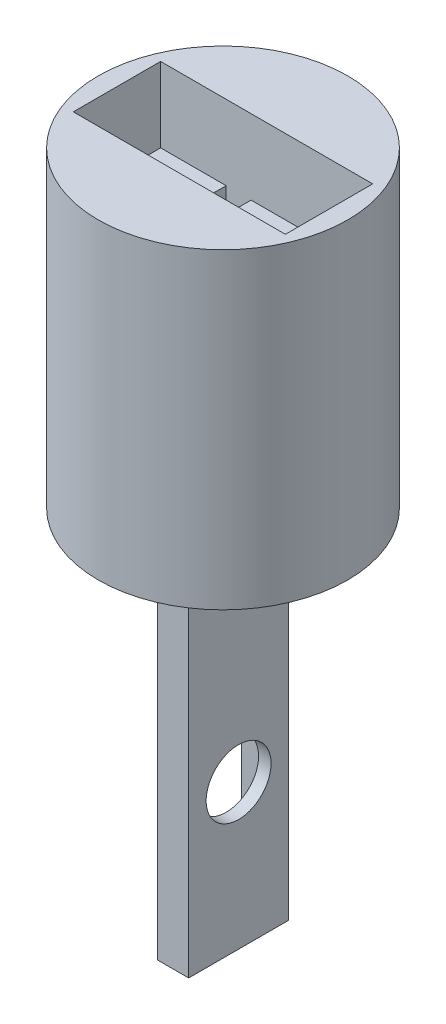
ISO-10303-21;
HEADER;
FILE_DESCRIPTION(('STEP AP214'),'2;1');
FILE_NAME('part.step','',(''),(''),'','','');
FILE_SCHEMA(('AUTOMOTIVE_DESIGN { 1 0 10303 214 1 1 1 1 }'));
ENDSEC;
DATA;
#1=APPLICATION_CONTEXT('core data for automotive mechanical design processes');
#2=APPLICATION_PROTOCOL_DEFINITION('international standard','automotive_design',2000,#1);
#3=PRODUCT_CONTEXT('',#1,'mechanical');
#4=PRODUCT('Part','Part','',(#3));
#5=PRODUCT_RELATED_PRODUCT_CATEGORY('part','',(#4));
#6=PRODUCT_DEFINITION_FORMATION('','',#4);
#7=PRODUCT_DEFINITION_CONTEXT('part definition',#1,'design');
#8=PRODUCT_DEFINITION('design','',#6,#7);
#9=PRODUCT_DEFINITION_SHAPE('','',#8);
#10=(LENGTH_UNIT() NAMED_UNIT(*) SI_UNIT(.MILLI.,.METRE.));
#11=(NAMED_UNIT(*) PLANE_ANGLE_UNIT() SI_UNIT($,.RADIAN.));
#12=(NAMED_UNIT(*) SI_UNIT($,.STERADIAN.) SOLID_ANGLE_UNIT());
#13=UNCERTAINTY_MEASURE_WITH_UNIT(LENGTH_MEASURE(1.E-05),#10,'distance_accuracy_value','');
#14=(GEOMETRIC_REPRESENTATION_CONTEXT(3) GLOBAL_UNCERTAINTY_ASSIGNED_CONTEXT((#13)) GLOBAL_UNIT_ASSIGNED_CONTEXT((#10,
#11,#12)) REPRESENTATION_CONTEXT('',''));
#15=CARTESIAN_POINT('',(0.,0.,0.));
#16=DIRECTION('',(0.,0.,1.));
#17=DIRECTION('',(1.,0.,0.));
#18=AXIS2_PLACEMENT_3D('',#15,#16,#17);
#19=CARTESIAN_POINT('',(0.,19.,0.));
#20=DIRECTION('',(0.,-1.,0.));
#21=DIRECTION('',(0.,0.,-1.));
#22=AXIS2_PLACEMENT_3D('',#19,#20,#21);
#23=PLANE('',#22);
#24=DIRECTION('',(0.,0.,-1.));
#25=VECTOR('',#24,1.);
#26=CARTESIAN_POINT('',(-1.25,19.,-3.5));
#27=LINE('',#26,#25);
#28=CARTESIAN_POINT('',(-1.25,19.,3.5));
#29=VERTEX_POINT('',#28);
#30=CARTESIAN_POINT('',(-1.25,19.,-3.5));
#31=VERTEX_POINT('',#30);
#32=EDGE_CURVE('E160',#29,#31,#27,.T.);
#33=ORIENTED_EDGE('',*,*,#32,.F.);
#34=DIRECTION('',(1.,0.,0.));
#35=VECTOR('',#34,1.);
#36=CARTESIAN_POINT('',(-8.5,19.,3.5));
#37=LINE('',#36,#35);
#38=CARTESIAN_POINT('',(8.5,19.,3.5));
#39=VERTEX_POINT('',#38);
#40=EDGE_CURVE('E192',#29,#39,#37,.T.);
#41=ORIENTED_EDGE('',*,*,#40,.T.);
#42=DIRECTION('',(0.,0.,-1.));
#43=VECTOR('',#42,1.);
#44=CARTESIAN_POINT('',(8.5,19.,3.5));
#45=LINE('',#44,#43);
#46=CARTESIAN_POINT('',(8.5,19.,-3.5));
#47=VERTEX_POINT('',#46);
#48=EDGE_CURVE('E197',#39,#47,#45,.T.);
#49=ORIENTED_EDGE('',*,*,#48,.T.);
#50=DIRECTION('',(-1.,0.,0.));
#51=VECTOR('',#50,1.);
#52=CARTESIAN_POINT('',(-8.5,19.,-3.5));
#53=LINE('',#52,#51);
#54=EDGE_CURVE('E201',#47,#31,#53,.T.);
#55=ORIENTED_EDGE('',*,*,#54,.T.);
#56=EDGE_LOOP('',(#33,#41,#49,#55));
#57=FACE_BOUND('',#56,.T.);
#58=ADVANCED_FACE('F37',(#57),#23,.F.);
#59=DIRECTION('',(0.,0.,1.));
#60=VECTOR('',#59,1.);
#61=CARTESIAN_POINT('',(-3.25,19.,-3.5));
#62=LINE('',#61,#60);
#63=CARTESIAN_POINT('',(-3.25,19.,-3.5));
#64=VERTEX_POINT('',#63);
#65=CARTESIAN_POINT('',(-3.25,19.,3.5));
#66=VERTEX_POINT('',#65);
#67=EDGE_CURVE('E177',#64,#66,#62,.T.);
#68=ORIENTED_EDGE('',*,*,#67,.F.);
#69=CARTESIAN_POINT('',(-8.5,19.,-3.5));
#70=VERTEX_POINT('',#69);
#71=EDGE_CURVE('E200',#64,#70,#53,.T.);
#72=ORIENTED_EDGE('',*,*,#71,.T.);
#73=DIRECTION('',(0.,0.,1.));
#74=VECTOR('',#73,1.);
#75=CARTESIAN_POINT('',(-8.5,19.,3.5));
#76=LINE('',#75,#74);
#77=CARTESIAN_POINT('',(-8.5,19.,3.5));
#78=VERTEX_POINT('',#77);
#79=EDGE_CURVE('E189',#70,#78,#76,.T.);
#80=ORIENTED_EDGE('',*,*,#79,.T.);
#81=EDGE_CURVE('E194',#78,#66,#37,.T.);
#82=ORIENTED_EDGE('',*,*,#81,.T.);
#83=EDGE_LOOP('',(#68,#72,#80,#82));
#84=FACE_BOUND('',#83,.T.);
#85=ADVANCED_FACE('F293',(#84),#23,.F.);
#86=CARTESIAN_POINT('',(0.,0.,0.));
#87=DIRECTION('',(0.,1.,0.));
#88=DIRECTION('',(0.,0.,1.));
#89=AXIS2_PLACEMENT_3D('',#86,#87,#88);
#90=PLANE('',#89);
#91=CARTESIAN_POINT('',(0.,0.,0.));
#92=DIRECTION('',(0.,1.,0.));
#93=DIRECTION('',(0.,0.,1.));
#94=AXIS2_PLACEMENT_3D('',#91,#92,#93);
#95=CIRCLE('',#94,10.);
#96=CARTESIAN_POINT('',(0.,0.,10.));
#97=VERTEX_POINT('',#96);
#98=EDGE_CURVE('E46',#97,#97,#95,.T.);
#99=ORIENTED_EDGE('',*,*,#98,.F.);
#100=EDGE_LOOP('',(#99));
#101=FACE_BOUND('',#100,.T.);
#102=DIRECTION('',(0.,0.,1.));
#103=VECTOR('',#102,1.);
#104=CARTESIAN_POINT('',(1.25,0.,-4.));
#105=LINE('',#104,#103);
#106=CARTESIAN_POINT('',(1.25,0.,-4.));
#107=VERTEX_POINT('',#106);
#108=CARTESIAN_POINT('',(1.25,0.,4.));
#109=VERTEX_POINT('',#108);
#110=EDGE_CURVE('E254',#107,#109,#105,.T.);
#111=ORIENTED_EDGE('',*,*,#110,.F.);
#112=DIRECTION('',(1.,0.,0.));
#113=VECTOR('',#112,1.);
#114=CARTESIAN_POINT('',(-1.25,0.,-4.));
#115=LINE('',#114,#113);
#116=CARTESIAN_POINT('',(-1.25,0.,-4.));
#117=VERTEX_POINT('',#116);
#118=EDGE_CURVE('E259',#117,#107,#115,.T.);
#119=ORIENTED_EDGE('',*,*,#118,.F.);
#120=DIRECTION('',(0.,0.,-1.));
#121=VECTOR('',#120,1.);
#122=CARTESIAN_POINT('',(-1.25,0.,-4.));
#123=LINE('',#122,#121);
#124=CARTESIAN_POINT('',(-1.25,0.,4.));
#125=VERTEX_POINT('',#124);
#126=EDGE_CURVE('E271',#125,#117,#123,.T.);
#127=ORIENTED_EDGE('',*,*,#126,.F.);
#128=DIRECTION('',(-1.,0.,0.));
#129=VECTOR('',#128,1.);
#130=CARTESIAN_POINT('',(-1.25,0.,4.));
#131=LINE('',#130,#129);
#132=EDGE_CURVE('E268',#109,#125,#131,.T.);
#133=ORIENTED_EDGE('',*,*,#132,.F.);
#134=EDGE_LOOP('',(#111,#119,#127,#133));
#135=FACE_BOUND('',#134,.T.);
#136=ADVANCED_FACE('F290',(#101,#135),#90,.F.);
#137=CARTESIAN_POINT('',(0.,25.,0.));
#138=DIRECTION('',(0.,-1.,0.));
#139=DIRECTION('',(0.,0.,-1.));
#140=AXIS2_PLACEMENT_3D('',#137,#138,#139);
#141=CYLINDRICAL_SURFACE('',#140,10.);
#142=CARTESIAN_POINT('',(0.,25.,0.));
#143=DIRECTION('',(0.,1.,0.));
#144=DIRECTION('',(0.,0.,1.));
#145=AXIS2_PLACEMENT_3D('',#142,#143,#144);
#146=CIRCLE('',#145,10.);
#147=CARTESIAN_POINT('',(0.,25.,10.));
#148=VERTEX_POINT('',#147);
#149=EDGE_CURVE('E11',#148,#148,#146,.T.);
#150=ORIENTED_EDGE('',*,*,#149,.F.);
#151=EDGE_LOOP('',(#150));
#152=FACE_BOUND('',#151,.T.);
#153=ORIENTED_EDGE('',*,*,#98,.T.);
#154=EDGE_LOOP('',(#153));
#155=FACE_BOUND('',#154,.T.);
#156=ADVANCED_FACE('F39',(#152,#155),#141,.T.);
#157=CARTESIAN_POINT('',(0.,25.,0.));
#158=DIRECTION('',(0.,1.,0.));
#159=DIRECTION('',(0.,0.,1.));
#160=AXIS2_PLACEMENT_3D('',#157,#158,#159);
#161=PLANE('',#160);
#162=DIRECTION('',(0.,0.,1.));
#163=VECTOR('',#162,1.);
#164=CARTESIAN_POINT('',(-8.5,25.,3.5));
#165=LINE('',#164,#163);
#166=CARTESIAN_POINT('',(-8.5,25.,-3.5));
#167=VERTEX_POINT('',#166);
#168=CARTESIAN_POINT('',(-8.5,25.,3.5));
#169=VERTEX_POINT('',#168);
#170=EDGE_CURVE('E62',#167,#169,#165,.T.);
#171=ORIENTED_EDGE('',*,*,#170,.F.);
#172=DIRECTION('',(-1.,0.,0.));
#173=VECTOR('',#172,1.);
#174=CARTESIAN_POINT('',(-8.5,25.,-3.5));
#175=LINE('',#174,#173);
#176=CARTESIAN_POINT('',(8.5,25.,-3.5));
#177=VERTEX_POINT('',#176);
#178=EDGE_CURVE('E193',#177,#167,#175,.T.);
#179=ORIENTED_EDGE('',*,*,#178,.F.);
#180=DIRECTION('',(0.,0.,-1.));
#181=VECTOR('',#180,1.);
#182=CARTESIAN_POINT('',(8.5,25.,3.5));
#183=LINE('',#182,#181);
#184=CARTESIAN_POINT('',(8.5,25.,3.5));
#185=VERTEX_POINT('',#184);
#186=EDGE_CURVE('E208',#185,#177,#183,.T.);
#187=ORIENTED_EDGE('',*,*,#186,.F.);
#188=DIRECTION('',(1.,0.,0.));
#189=VECTOR('',#188,1.);
#190=CARTESIAN_POINT('',(-8.5,25.,3.5));
#191=LINE('',#190,#189);
#192=EDGE_CURVE('E205',#169,#185,#191,.T.);
#193=ORIENTED_EDGE('',*,*,#192,.F.);
#194=EDGE_LOOP('',(#171,#179,#187,#193));
#195=FACE_BOUND('',#194,.T.);
#196=ORIENTED_EDGE('',*,*,#149,.T.);
#197=EDGE_LOOP('',(#196));
#198=FACE_BOUND('',#197,.T.);
#199=ADVANCED_FACE('F319',(#195,#198),#161,.T.);
#200=CARTESIAN_POINT('',(1.25,-30.,-4.));
#201=DIRECTION('',(-1.,0.,0.));
#202=DIRECTION('',(0.,0.,1.));
#203=AXIS2_PLACEMENT_3D('',#200,#201,#202);
#204=PLANE('',#203);
#205=CARTESIAN_POINT('',(1.25,-18.4,0.));
#206=DIRECTION('',(1.,0.,0.));
#207=DIRECTION('',(0.,0.,-1.));
#208=AXIS2_PLACEMENT_3D('',#205,#206,#207);
#209=CIRCLE('',#208,2.6);
#210=CARTESIAN_POINT('',(1.25,-18.4,-2.6));
#211=VERTEX_POINT('',#210);
#212=EDGE_CURVE('E251',#211,#211,#209,.T.);
#213=ORIENTED_EDGE('',*,*,#212,.F.);
#214=EDGE_LOOP('',(#213));
#215=FACE_BOUND('',#214,.T.);
#216=ORIENTED_EDGE('',*,*,#110,.T.);
#217=DIRECTION('',(0.,1.,0.));
#218=VECTOR('',#217,1.);
#219=CARTESIAN_POINT('',(1.25,-30.,4.));
#220=LINE('',#219,#218);
#221=CARTESIAN_POINT('',(1.25,-30.,4.));
#222=VERTEX_POINT('',#221);
#223=EDGE_CURVE('E284',#222,#109,#220,.T.);
#224=ORIENTED_EDGE('',*,*,#223,.F.);
#225=DIRECTION('',(0.,0.,1.));
#226=VECTOR('',#225,1.);
#227=CARTESIAN_POINT('',(1.25,-30.,-4.));
#228=LINE('',#227,#226);
#229=CARTESIAN_POINT('',(1.25,-30.,-4.));
#230=VERTEX_POINT('',#229);
#231=EDGE_CURVE('E255',#230,#222,#228,.T.);
#232=ORIENTED_EDGE('',*,*,#231,.F.);
#233=DIRECTION('',(0.,1.,0.));
#234=VECTOR('',#233,1.);
#235=CARTESIAN_POINT('',(1.25,-30.,-4.));
#236=LINE('',#235,#234);
#237=EDGE_CURVE('E265',#230,#107,#236,.T.);
#238=ORIENTED_EDGE('',*,*,#237,.T.);
#239=EDGE_LOOP('',(#216,#224,#232,#238));
#240=FACE_BOUND('',#239,.T.);
#241=ADVANCED_FACE('F302',(#215,#240),#204,.F.);
#242=CARTESIAN_POINT('',(-1.25,-30.,4.));
#243=DIRECTION('',(0.,0.,-1.));
#244=DIRECTION('',(-1.,0.,0.));
#245=AXIS2_PLACEMENT_3D('',#242,#243,#244);
#246=PLANE('',#245);
#247=ORIENTED_EDGE('',*,*,#132,.T.);
#248=DIRECTION('',(0.,1.,0.));
#249=VECTOR('',#248,1.);
#250=CARTESIAN_POINT('',(-1.25,-30.,4.));
#251=LINE('',#250,#249);
#252=CARTESIAN_POINT('',(-1.25,-30.,4.));
#253=VERTEX_POINT('',#252);
#254=EDGE_CURVE('E281',#253,#125,#251,.T.);
#255=ORIENTED_EDGE('',*,*,#254,.F.);
#256=DIRECTION('',(-1.,0.,0.));
#257=VECTOR('',#256,1.);
#258=CARTESIAN_POINT('',(-1.25,-30.,4.));
#259=LINE('',#258,#257);
#260=EDGE_CURVE('E258',#222,#253,#259,.T.);
#261=ORIENTED_EDGE('',*,*,#260,.F.);
#262=ORIENTED_EDGE('',*,*,#223,.T.);
#263=EDGE_LOOP('',(#247,#255,#261,#262));
#264=FACE_BOUND('',#263,.T.);
#265=ADVANCED_FACE('F310',(#264),#246,.F.);
#266=CARTESIAN_POINT('',(-1.25,-30.,-4.));
#267=DIRECTION('',(1.,0.,0.));
#268=DIRECTION('',(0.,0.,-1.));
#269=AXIS2_PLACEMENT_3D('',#266,#267,#268);
#270=PLANE('',#269);
#271=DIRECTION('',(0.,0.,-1.));
#272=VECTOR('',#271,1.);
#273=CARTESIAN_POINT('',(-1.25,-7.8,-2.75));
#274=LINE('',#273,#272);
#275=CARTESIAN_POINT('',(-1.25,-7.8,2.75));
#276=VERTEX_POINT('',#275);
#277=CARTESIAN_POINT('',(-1.25,-7.8,-2.75));
#278=VERTEX_POINT('',#277);
#279=EDGE_CURVE('E235',#276,#278,#274,.T.);
#280=ORIENTED_EDGE('',*,*,#279,.F.);
#281=DIRECTION('',(0.,1.,0.));
#282=VECTOR('',#281,1.);
#283=CARTESIAN_POINT('',(-1.25,-29.,2.75));
#284=LINE('',#283,#282);
#285=CARTESIAN_POINT('',(-1.25,-29.,2.75));
#286=VERTEX_POINT('',#285);
#287=EDGE_CURVE('E214',#286,#276,#284,.T.);
#288=ORIENTED_EDGE('',*,*,#287,.F.);
#289=DIRECTION('',(0.,0.,1.));
#290=VECTOR('',#289,1.);
#291=CARTESIAN_POINT('',(-1.25,-29.,-2.75));
#292=LINE('',#291,#290);
#293=CARTESIAN_POINT('',(-1.25,-29.,-2.75));
#294=VERTEX_POINT('',#293);
#295=EDGE_CURVE('E224',#294,#286,#292,.T.);
#296=ORIENTED_EDGE('',*,*,#295,.F.);
#297=DIRECTION('',(0.,-1.,0.));
#298=VECTOR('',#297,1.);
#299=CARTESIAN_POINT('',(-1.25,-29.,-2.75));
#300=LINE('',#299,#298);
#301=EDGE_CURVE('E238',#278,#294,#300,.T.);
#302=ORIENTED_EDGE('',*,*,#301,.F.);
#303=EDGE_LOOP('',(#280,#288,#296,#302));
#304=FACE_BOUND('',#303,.T.);
#305=ORIENTED_EDGE('',*,*,#126,.T.);
#306=DIRECTION('',(0.,1.,0.));
#307=VECTOR('',#306,1.);
#308=CARTESIAN_POINT('',(-1.25,-30.,-4.));
#309=LINE('',#308,#307);
#310=CARTESIAN_POINT('',(-1.25,-30.,-4.));
#311=VERTEX_POINT('',#310);
#312=EDGE_CURVE('E278',#311,#117,#309,.T.);
#313=ORIENTED_EDGE('',*,*,#312,.F.);
#314=DIRECTION('',(0.,0.,-1.));
#315=VECTOR('',#314,1.);
#316=CARTESIAN_POINT('',(-1.25,-30.,-4.));
#317=LINE('',#316,#315);
#318=EDGE_CURVE('E261',#253,#311,#317,.T.);
#319=ORIENTED_EDGE('',*,*,#318,.F.);
#320=ORIENTED_EDGE('',*,*,#254,.T.);
#321=EDGE_LOOP('',(#305,#313,#319,#320));
#322=FACE_BOUND('',#321,.T.);
#323=ADVANCED_FACE('F308',(#304,#322),#270,.F.);
#324=CARTESIAN_POINT('',(-1.25,-30.,-4.));
#325=DIRECTION('',(0.,0.,1.));
#326=DIRECTION('',(1.,0.,0.));
#327=AXIS2_PLACEMENT_3D('',#324,#325,#326);
#328=PLANE('',#327);
#329=ORIENTED_EDGE('',*,*,#118,.T.);
#330=ORIENTED_EDGE('',*,*,#237,.F.);
#331=DIRECTION('',(1.,0.,0.));
#332=VECTOR('',#331,1.);
#333=CARTESIAN_POINT('',(-1.25,-30.,-4.));
#334=LINE('',#333,#332);
#335=EDGE_CURVE('E263',#311,#230,#334,.T.);
#336=ORIENTED_EDGE('',*,*,#335,.F.);
#337=ORIENTED_EDGE('',*,*,#312,.T.);
#338=EDGE_LOOP('',(#329,#330,#336,#337));
#339=FACE_BOUND('',#338,.T.);
#340=ADVANCED_FACE('F298',(#339),#328,.F.);
#341=CARTESIAN_POINT('',(0.,-30.,0.));
#342=DIRECTION('',(0.,1.,0.));
#343=DIRECTION('',(0.,0.,1.));
#344=AXIS2_PLACEMENT_3D('',#341,#342,#343);
#345=PLANE('',#344);
#346=ORIENTED_EDGE('',*,*,#231,.T.);
#347=ORIENTED_EDGE('',*,*,#260,.T.);
#348=ORIENTED_EDGE('',*,*,#318,.T.);
#349=ORIENTED_EDGE('',*,*,#335,.T.);
#350=EDGE_LOOP('',(#346,#347,#348,#349));
#351=FACE_BOUND('',#350,.T.);
#352=ADVANCED_FACE('F304',(#351),#345,.F.);
#353=CARTESIAN_POINT('',(-10.001,-18.4,0.));
#354=DIRECTION('',(1.,0.,0.));
#355=DIRECTION('',(0.,0.,-1.));
#356=AXIS2_PLACEMENT_3D('',#353,#354,#355);
#357=CYLINDRICAL_SURFACE('',#356,2.6);
#358=CARTESIAN_POINT('',(0.249999999999999,-18.4,0.));
#359=DIRECTION('',(1.,0.,0.));
#360=DIRECTION('',(0.,0.,-1.));
#361=AXIS2_PLACEMENT_3D('',#358,#359,#360);
#362=CIRCLE('',#361,2.6);
#363=CARTESIAN_POINT('',(0.249999999999999,-18.4,-2.6));
#364=VERTEX_POINT('',#363);
#365=EDGE_CURVE('E41',#364,#364,#362,.F.);
#366=ORIENTED_EDGE('',*,*,#365,.T.);
#367=EDGE_LOOP('',(#366));
#368=FACE_BOUND('',#367,.T.);
#369=ORIENTED_EDGE('',*,*,#212,.T.);
#370=EDGE_LOOP('',(#369));
#371=FACE_BOUND('',#370,.T.);
#372=ADVANCED_FACE('F350',(#368,#371),#357,.F.);
#373=CARTESIAN_POINT('',(0.249999999999999,0.,0.));
#374=DIRECTION('',(1.,0.,0.));
#375=DIRECTION('',(0.,0.,-1.));
#376=AXIS2_PLACEMENT_3D('',#373,#374,#375);
#377=PLANE('',#376);
#378=DIRECTION('',(0.,1.,0.));
#379=VECTOR('',#378,1.);
#380=CARTESIAN_POINT('',(0.249999999999999,-29.,2.75));
#381=LINE('',#380,#379);
#382=CARTESIAN_POINT('',(0.249999999999999,-29.,2.75));
#383=VERTEX_POINT('',#382);
#384=CARTESIAN_POINT('',(0.249999999999999,-7.8,2.75));
#385=VERTEX_POINT('',#384);
#386=EDGE_CURVE('E220',#383,#385,#381,.T.);
#387=ORIENTED_EDGE('',*,*,#386,.T.);
#388=DIRECTION('',(0.,0.,-1.));
#389=VECTOR('',#388,1.);
#390=CARTESIAN_POINT('',(0.25,-7.8,-2.75));
#391=LINE('',#390,#389);
#392=CARTESIAN_POINT('',(0.25,-7.8,-2.75));
#393=VERTEX_POINT('',#392);
#394=EDGE_CURVE('E223',#385,#393,#391,.T.);
#395=ORIENTED_EDGE('',*,*,#394,.T.);
#396=DIRECTION('',(0.,-1.,0.));
#397=VECTOR('',#396,1.);
#398=CARTESIAN_POINT('',(0.25,-29.,-2.75));
#399=LINE('',#398,#397);
#400=CARTESIAN_POINT('',(0.25,-29.,-2.75));
#401=VERTEX_POINT('',#400);
#402=EDGE_CURVE('E227',#393,#401,#399,.T.);
#403=ORIENTED_EDGE('',*,*,#402,.T.);
#404=DIRECTION('',(0.,0.,1.));
#405=VECTOR('',#404,1.);
#406=CARTESIAN_POINT('',(0.25,-29.,-2.75));
#407=LINE('',#406,#405);
#408=EDGE_CURVE('E230',#401,#383,#407,.T.);
#409=ORIENTED_EDGE('',*,*,#408,.T.);
#410=EDGE_LOOP('',(#387,#395,#403,#409));
#411=FACE_BOUND('',#410,.T.);
#412=ORIENTED_EDGE('',*,*,#365,.F.);
#413=EDGE_LOOP('',(#412));
#414=FACE_BOUND('',#413,.T.);
#415=ADVANCED_FACE('F346',(#411,#414),#377,.F.);
#416=CARTESIAN_POINT('',(0.249999999999999,-29.,2.75));
#417=DIRECTION('',(0.,0.,1.));
#418=DIRECTION('',(1.,0.,0.));
#419=AXIS2_PLACEMENT_3D('',#416,#417,#418);
#420=PLANE('',#419);
#421=ORIENTED_EDGE('',*,*,#287,.T.);
#422=DIRECTION('',(-1.,0.,0.));
#423=VECTOR('',#422,1.);
#424=CARTESIAN_POINT('',(0.249999999999999,-7.8,2.75));
#425=LINE('',#424,#423);
#426=EDGE_CURVE('E233',#385,#276,#425,.T.);
#427=ORIENTED_EDGE('',*,*,#426,.F.);
#428=ORIENTED_EDGE('',*,*,#386,.F.);
#429=DIRECTION('',(-1.,0.,0.));
#430=VECTOR('',#429,1.);
#431=CARTESIAN_POINT('',(0.249999999999999,-29.,2.75));
#432=LINE('',#431,#430);
#433=EDGE_CURVE('E243',#383,#286,#432,.T.);
#434=ORIENTED_EDGE('',*,*,#433,.T.);
#435=EDGE_LOOP('',(#421,#427,#428,#434));
#436=FACE_BOUND('',#435,.T.);
#437=ADVANCED_FACE('F349',(#436),#420,.F.);
#438=CARTESIAN_POINT('',(0.25,-29.,-2.75));
#439=DIRECTION('',(0.,-1.,0.));
#440=DIRECTION('',(0.,0.,-1.));
#441=AXIS2_PLACEMENT_3D('',#438,#439,#440);
#442=PLANE('',#441);
#443=ORIENTED_EDGE('',*,*,#295,.T.);
#444=ORIENTED_EDGE('',*,*,#433,.F.);
#445=ORIENTED_EDGE('',*,*,#408,.F.);
#446=DIRECTION('',(-1.,0.,0.));
#447=VECTOR('',#446,1.);
#448=CARTESIAN_POINT('',(0.25,-29.,-2.75));
#449=LINE('',#448,#447);
#450=EDGE_CURVE('E245',#401,#294,#449,.T.);
#451=ORIENTED_EDGE('',*,*,#450,.T.);
#452=EDGE_LOOP('',(#443,#444,#445,#451));
#453=FACE_BOUND('',#452,.T.);
#454=ADVANCED_FACE('F352',(#453),#442,.F.);
#455=CARTESIAN_POINT('',(0.25,-29.,-2.75));
#456=DIRECTION('',(0.,0.,-1.));
#457=DIRECTION('',(-1.,0.,0.));
#458=AXIS2_PLACEMENT_3D('',#455,#456,#457);
#459=PLANE('',#458);
#460=ORIENTED_EDGE('',*,*,#301,.T.);
#461=ORIENTED_EDGE('',*,*,#450,.F.);
#462=ORIENTED_EDGE('',*,*,#402,.F.);
#463=DIRECTION('',(-1.,0.,0.));
#464=VECTOR('',#463,1.);
#465=CARTESIAN_POINT('',(0.25,-7.8,-2.75));
#466=LINE('',#465,#464);
#467=EDGE_CURVE('E247',#393,#278,#466,.T.);
#468=ORIENTED_EDGE('',*,*,#467,.T.);
#469=EDGE_LOOP('',(#460,#461,#462,#468));
#470=FACE_BOUND('',#469,.T.);
#471=ADVANCED_FACE('F355',(#470),#459,.F.);
#472=CARTESIAN_POINT('',(0.25,-7.8,-2.75));
#473=DIRECTION('',(0.,1.,0.));
#474=DIRECTION('',(0.,0.,1.));
#475=AXIS2_PLACEMENT_3D('',#472,#473,#474);
#476=PLANE('',#475);
#477=ORIENTED_EDGE('',*,*,#279,.T.);
#478=ORIENTED_EDGE('',*,*,#467,.F.);
#479=ORIENTED_EDGE('',*,*,#394,.F.);
#480=ORIENTED_EDGE('',*,*,#426,.T.);
#481=EDGE_LOOP('',(#477,#478,#479,#480));
#482=FACE_BOUND('',#481,.T.);
#483=ADVANCED_FACE('F345',(#482),#476,.F.);
#484=CARTESIAN_POINT('',(-8.5,19.,3.5));
#485=DIRECTION('',(-1.,0.,0.));
#486=DIRECTION('',(0.,0.,1.));
#487=AXIS2_PLACEMENT_3D('',#484,#485,#486);
#488=PLANE('',#487);
#489=ORIENTED_EDGE('',*,*,#170,.T.);
#490=DIRECTION('',(0.,1.,0.));
#491=VECTOR('',#490,1.);
#492=CARTESIAN_POINT('',(-8.5,19.,3.5));
#493=LINE('',#492,#491);
#494=EDGE_CURVE('E203',#78,#169,#493,.T.);
#495=ORIENTED_EDGE('',*,*,#494,.F.);
#496=ORIENTED_EDGE('',*,*,#79,.F.);
#497=DIRECTION('',(0.,1.,0.));
#498=VECTOR('',#497,1.);
#499=CARTESIAN_POINT('',(-8.5,19.,-3.5));
#500=LINE('',#499,#498);
#501=EDGE_CURVE('E212',#70,#167,#500,.T.);
#502=ORIENTED_EDGE('',*,*,#501,.T.);
#503=EDGE_LOOP('',(#489,#495,#496,#502));
#504=FACE_BOUND('',#503,.T.);
#505=ADVANCED_FACE('F335',(#504),#488,.F.);
#506=CARTESIAN_POINT('',(-8.5,19.,-3.5));
#507=DIRECTION('',(0.,0.,-1.));
#508=DIRECTION('',(-1.,0.,0.));
#509=AXIS2_PLACEMENT_3D('',#506,#507,#508);
#510=PLANE('',#509);
#511=ORIENTED_EDGE('',*,*,#178,.T.);
#512=ORIENTED_EDGE('',*,*,#501,.F.);
#513=ORIENTED_EDGE('',*,*,#71,.F.);
#514=DIRECTION('',(0.,1.,0.));
#515=VECTOR('',#514,1.);
#516=CARTESIAN_POINT('',(-3.25,15.,-3.5));
#517=LINE('',#516,#515);
#518=CARTESIAN_POINT('',(-3.25,15.,-3.5));
#519=VERTEX_POINT('',#518);
#520=EDGE_CURVE('E54',#519,#64,#517,.T.);
#521=ORIENTED_EDGE('',*,*,#520,.F.);
#522=DIRECTION('',(-1.,0.,0.));
#523=VECTOR('',#522,1.);
#524=CARTESIAN_POINT('',(-1.25,15.,-3.5));
#525=LINE('',#524,#523);
#526=CARTESIAN_POINT('',(-1.25,15.,-3.5));
#527=VERTEX_POINT('',#526);
#528=EDGE_CURVE('E167',#527,#519,#525,.T.);
#529=ORIENTED_EDGE('',*,*,#528,.F.);
#530=DIRECTION('',(0.,1.,0.));
#531=VECTOR('',#530,1.);
#532=CARTESIAN_POINT('',(-1.25,15.,-3.5));
#533=LINE('',#532,#531);
#534=EDGE_CURVE('E153',#527,#31,#533,.T.);
#535=ORIENTED_EDGE('',*,*,#534,.T.);
#536=ORIENTED_EDGE('',*,*,#54,.F.);
#537=DIRECTION('',(0.,1.,0.));
#538=VECTOR('',#537,1.);
#539=CARTESIAN_POINT('',(8.5,19.,-3.5));
#540=LINE('',#539,#538);
#541=EDGE_CURVE('E215',#47,#177,#540,.T.);
#542=ORIENTED_EDGE('',*,*,#541,.T.);
#543=EDGE_LOOP('',(#511,#512,#513,#521,#529,#535,#536,#542));
#544=FACE_BOUND('',#543,.T.);
#545=ADVANCED_FACE('F169',(#544),#510,.F.);
#546=CARTESIAN_POINT('',(8.5,19.,3.5));
#547=DIRECTION('',(1.,0.,0.));
#548=DIRECTION('',(0.,0.,-1.));
#549=AXIS2_PLACEMENT_3D('',#546,#547,#548);
#550=PLANE('',#549);
#551=ORIENTED_EDGE('',*,*,#186,.T.);
#552=ORIENTED_EDGE('',*,*,#541,.F.);
#553=ORIENTED_EDGE('',*,*,#48,.F.);
#554=DIRECTION('',(0.,1.,0.));
#555=VECTOR('',#554,1.);
#556=CARTESIAN_POINT('',(8.5,19.,3.5));
#557=LINE('',#556,#555);
#558=EDGE_CURVE('E217',#39,#185,#557,.T.);
#559=ORIENTED_EDGE('',*,*,#558,.T.);
#560=EDGE_LOOP('',(#551,#552,#553,#559));
#561=FACE_BOUND('',#560,.T.);
#562=ADVANCED_FACE('F334',(#561),#550,.F.);
#563=CARTESIAN_POINT('',(-8.5,19.,3.5));
#564=DIRECTION('',(0.,0.,1.));
#565=DIRECTION('',(1.,0.,0.));
#566=AXIS2_PLACEMENT_3D('',#563,#564,#565);
#567=PLANE('',#566);
#568=ORIENTED_EDGE('',*,*,#192,.T.);
#569=ORIENTED_EDGE('',*,*,#558,.F.);
#570=ORIENTED_EDGE('',*,*,#40,.F.);
#571=DIRECTION('',(0.,1.,0.));
#572=VECTOR('',#571,1.);
#573=CARTESIAN_POINT('',(-1.25,15.,3.5));
#574=LINE('',#573,#572);
#575=CARTESIAN_POINT('',(-1.25,15.,3.5));
#576=VERTEX_POINT('',#575);
#577=EDGE_CURVE('E184',#576,#29,#574,.T.);
#578=ORIENTED_EDGE('',*,*,#577,.F.);
#579=DIRECTION('',(1.,0.,0.));
#580=VECTOR('',#579,1.);
#581=CARTESIAN_POINT('',(-1.25,15.,3.5));
#582=LINE('',#581,#580);
#583=CARTESIAN_POINT('',(-3.25,15.,3.5));
#584=VERTEX_POINT('',#583);
#585=EDGE_CURVE('E164',#584,#576,#582,.T.);
#586=ORIENTED_EDGE('',*,*,#585,.F.);
#587=DIRECTION('',(0.,1.,0.));
#588=VECTOR('',#587,1.);
#589=CARTESIAN_POINT('',(-3.25,15.,3.5));
#590=LINE('',#589,#588);
#591=EDGE_CURVE('E186',#584,#66,#590,.T.);
#592=ORIENTED_EDGE('',*,*,#591,.T.);
#593=ORIENTED_EDGE('',*,*,#81,.F.);
#594=ORIENTED_EDGE('',*,*,#494,.T.);
#595=EDGE_LOOP('',(#568,#569,#570,#578,#586,#592,#593,#594));
#596=FACE_BOUND('',#595,.T.);
#597=ADVANCED_FACE('F338',(#596),#567,.F.);
#598=CARTESIAN_POINT('',(-1.25,15.,-3.5));
#599=DIRECTION('',(1.,0.,0.));
#600=DIRECTION('',(0.,0.,-1.));
#601=AXIS2_PLACEMENT_3D('',#598,#599,#600);
#602=PLANE('',#601);
#603=ORIENTED_EDGE('',*,*,#32,.T.);
#604=ORIENTED_EDGE('',*,*,#534,.F.);
#605=DIRECTION('',(0.,0.,-1.));
#606=VECTOR('',#605,1.);
#607=CARTESIAN_POINT('',(-1.25,15.,-3.5));
#608=LINE('',#607,#606);
#609=EDGE_CURVE('E157',#576,#527,#608,.T.);
#610=ORIENTED_EDGE('',*,*,#609,.F.);
#611=ORIENTED_EDGE('',*,*,#577,.T.);
#612=EDGE_LOOP('',(#603,#604,#610,#611));
#613=FACE_BOUND('',#612,.T.);
#614=ADVANCED_FACE('F155',(#613),#602,.F.);
#615=CARTESIAN_POINT('',(-3.25,15.,-3.5));
#616=DIRECTION('',(-1.,0.,0.));
#617=DIRECTION('',(0.,0.,1.));
#618=AXIS2_PLACEMENT_3D('',#615,#616,#617);
#619=PLANE('',#618);
#620=ORIENTED_EDGE('',*,*,#67,.T.);
#621=ORIENTED_EDGE('',*,*,#591,.F.);
#622=DIRECTION('',(0.,0.,1.));
#623=VECTOR('',#622,1.);
#624=CARTESIAN_POINT('',(-3.25,15.,-3.5));
#625=LINE('',#624,#623);
#626=EDGE_CURVE('E173',#519,#584,#625,.T.);
#627=ORIENTED_EDGE('',*,*,#626,.F.);
#628=ORIENTED_EDGE('',*,*,#520,.T.);
#629=EDGE_LOOP('',(#620,#621,#627,#628));
#630=FACE_BOUND('',#629,.T.);
#631=ADVANCED_FACE('F429',(#630),#619,.F.);
#632=CARTESIAN_POINT('',(0.,15.,0.));
#633=DIRECTION('',(0.,-1.,0.));
#634=DIRECTION('',(0.,0.,-1.));
#635=AXIS2_PLACEMENT_3D('',#632,#633,#634);
#636=PLANE('',#635);
#637=ORIENTED_EDGE('',*,*,#609,.T.);
#638=ORIENTED_EDGE('',*,*,#528,.T.);
#639=ORIENTED_EDGE('',*,*,#626,.T.);
#640=ORIENTED_EDGE('',*,*,#585,.T.);
#641=EDGE_LOOP('',(#637,#638,#639,#640));
#642=FACE_BOUND('',#641,.T.);
#643=ADVANCED_FACE('F175',(#642),#636,.F.);
#644=CLOSED_SHELL('',(#58,#85,#136,#156,#199,#241,#265,#323,#340,#352,#372,#415,#437,#454,#471,
#483,#505,#545,#562,#597,#614,#631,#643));
#645=MANIFOLD_SOLID_BREP('B2',#644);
#646=ADVANCED_BREP_SHAPE_REPRESENTATION('',(#18,#645),#14);
#647=SHAPE_DEFINITION_REPRESENTATION(#9,#646);
ENDSEC;
END-ISO-10303-21;
